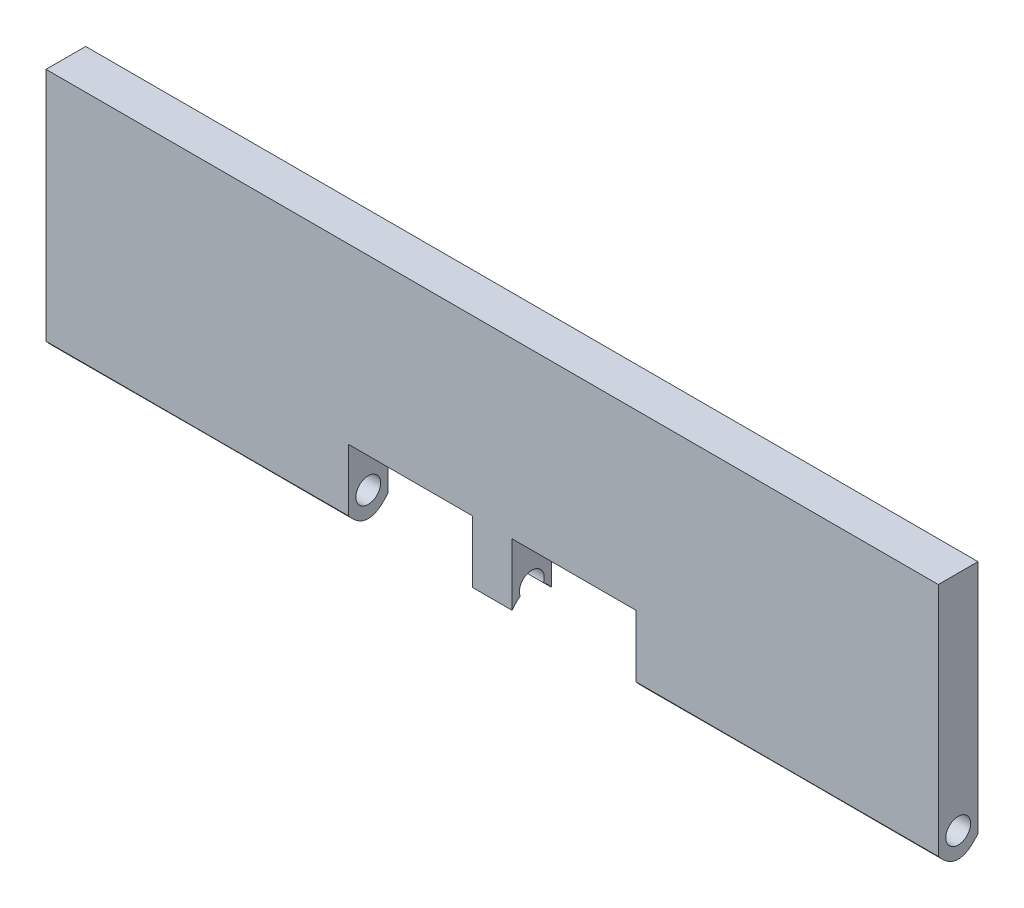
ISO-10303-21;
HEADER;
FILE_DESCRIPTION(('STEP AP214'),'2;1');
FILE_NAME('part.step','',(''),(''),'','','');
FILE_SCHEMA(('AUTOMOTIVE_DESIGN { 1 0 10303 214 1 1 1 1 }'));
ENDSEC;
DATA;
#1=APPLICATION_CONTEXT('core data for automotive mechanical design processes');
#2=APPLICATION_PROTOCOL_DEFINITION('international standard','automotive_design',2000,#1);
#3=PRODUCT_CONTEXT('',#1,'mechanical');
#4=PRODUCT('Part','Part','',(#3));
#5=PRODUCT_RELATED_PRODUCT_CATEGORY('part','',(#4));
#6=PRODUCT_DEFINITION_FORMATION('','',#4);
#7=PRODUCT_DEFINITION_CONTEXT('part definition',#1,'design');
#8=PRODUCT_DEFINITION('design','',#6,#7);
#9=PRODUCT_DEFINITION_SHAPE('','',#8);
#10=(LENGTH_UNIT() NAMED_UNIT(*) SI_UNIT(.MILLI.,.METRE.));
#11=(NAMED_UNIT(*) PLANE_ANGLE_UNIT() SI_UNIT($,.RADIAN.));
#12=(NAMED_UNIT(*) SI_UNIT($,.STERADIAN.) SOLID_ANGLE_UNIT());
#13=UNCERTAINTY_MEASURE_WITH_UNIT(LENGTH_MEASURE(1.E-05),#10,'distance_accuracy_value','');
#14=(GEOMETRIC_REPRESENTATION_CONTEXT(3) GLOBAL_UNCERTAINTY_ASSIGNED_CONTEXT((#13)) GLOBAL_UNIT_ASSIGNED_CONTEXT((#10,
#11,#12)) REPRESENTATION_CONTEXT('',''));
#15=CARTESIAN_POINT('',(0.,0.,0.));
#16=DIRECTION('',(0.,0.,1.));
#17=DIRECTION('',(1.,0.,0.));
#18=AXIS2_PLACEMENT_3D('',#15,#16,#17);
#19=CARTESIAN_POINT('',(0.,0.,0.));
#20=DIRECTION('',(0.,0.,-1.));
#21=DIRECTION('',(-1.,0.,0.));
#22=AXIS2_PLACEMENT_3D('',#19,#20,#21);
#23=PLANE('',#22);
#24=DIRECTION('',(0.,1.,0.));
#25=VECTOR('',#24,1.);
#26=CARTESIAN_POINT('',(90.,-25.,0.));
#27=LINE('',#26,#25);
#28=CARTESIAN_POINT('',(90.,-22.5,0.));
#29=VERTEX_POINT('',#28);
#30=CARTESIAN_POINT('',(90.,25.,0.));
#31=VERTEX_POINT('',#30);
#32=EDGE_CURVE('E228',#29,#31,#27,.T.);
#33=ORIENTED_EDGE('',*,*,#32,.F.);
#34=DIRECTION('',(-1.,0.,0.));
#35=VECTOR('',#34,1.);
#36=CARTESIAN_POINT('',(97.0710678118654,-22.5,0.));
#37=LINE('',#36,#35);
#38=CARTESIAN_POINT('',(29.,-22.5,0.));
#39=VERTEX_POINT('',#38);
#40=EDGE_CURVE('E304',#29,#39,#37,.T.);
#41=ORIENTED_EDGE('',*,*,#40,.T.);
#42=DIRECTION('',(0.,-1.,0.));
#43=VECTOR('',#42,1.);
#44=CARTESIAN_POINT('',(29.,-25.,0.));
#45=LINE('',#44,#43);
#46=CARTESIAN_POINT('',(28.9999999999999,-10.,0.));
#47=VERTEX_POINT('',#46);
#48=EDGE_CURVE('E246',#47,#39,#45,.T.);
#49=ORIENTED_EDGE('',*,*,#48,.F.);
#50=DIRECTION('',(1.,0.,0.));
#51=VECTOR('',#50,1.);
#52=CARTESIAN_POINT('',(28.9999999999999,-10.,0.));
#53=LINE('',#52,#51);
#54=CARTESIAN_POINT('',(3.99999999999994,-10.,0.));
#55=VERTEX_POINT('',#54);
#56=EDGE_CURVE('E244',#55,#47,#53,.T.);
#57=ORIENTED_EDGE('',*,*,#56,.F.);
#58=DIRECTION('',(0.,1.,0.));
#59=VECTOR('',#58,1.);
#60=CARTESIAN_POINT('',(3.99999999999994,-10.,0.));
#61=LINE('',#60,#59);
#62=CARTESIAN_POINT('',(3.99999999999995,-22.5,0.));
#63=VERTEX_POINT('',#62);
#64=EDGE_CURVE('E242',#63,#55,#61,.T.);
#65=ORIENTED_EDGE('',*,*,#64,.F.);
#66=DIRECTION('',(-1.,0.,0.));
#67=VECTOR('',#66,1.);
#68=CARTESIAN_POINT('',(0.,-22.5,0.));
#69=LINE('',#68,#67);
#70=CARTESIAN_POINT('',(-4.,-22.5,0.));
#71=VERTEX_POINT('',#70);
#72=EDGE_CURVE('E268',#63,#71,#69,.T.);
#73=ORIENTED_EDGE('',*,*,#72,.T.);
#74=DIRECTION('',(0.,-1.,0.));
#75=VECTOR('',#74,1.);
#76=CARTESIAN_POINT('',(-4.,-10.,0.));
#77=LINE('',#76,#75);
#78=CARTESIAN_POINT('',(-4.,-10.,0.));
#79=VERTEX_POINT('',#78);
#80=EDGE_CURVE('E240',#79,#71,#77,.T.);
#81=ORIENTED_EDGE('',*,*,#80,.F.);
#82=DIRECTION('',(1.,0.,0.));
#83=VECTOR('',#82,1.);
#84=CARTESIAN_POINT('',(-29.,-10.,0.));
#85=LINE('',#84,#83);
#86=CARTESIAN_POINT('',(-29.,-10.,0.));
#87=VERTEX_POINT('',#86);
#88=EDGE_CURVE('E238',#87,#79,#85,.T.);
#89=ORIENTED_EDGE('',*,*,#88,.F.);
#90=DIRECTION('',(0.,1.,0.));
#91=VECTOR('',#90,1.);
#92=CARTESIAN_POINT('',(-29.,-25.,0.));
#93=LINE('',#92,#91);
#94=CARTESIAN_POINT('',(-29.,-22.5,0.));
#95=VERTEX_POINT('',#94);
#96=EDGE_CURVE('E236',#95,#87,#93,.T.);
#97=ORIENTED_EDGE('',*,*,#96,.F.);
#98=CARTESIAN_POINT('',(-90.,-22.5,0.));
#99=VERTEX_POINT('',#98);
#100=EDGE_CURVE('E195',#95,#99,#69,.T.);
#101=ORIENTED_EDGE('',*,*,#100,.T.);
#102=DIRECTION('',(0.,-1.,0.));
#103=VECTOR('',#102,1.);
#104=CARTESIAN_POINT('',(-90.,-25.,0.));
#105=LINE('',#104,#103);
#106=CARTESIAN_POINT('',(-90.,25.,0.));
#107=VERTEX_POINT('',#106);
#108=EDGE_CURVE('E233',#107,#99,#105,.T.);
#109=ORIENTED_EDGE('',*,*,#108,.F.);
#110=DIRECTION('',(-1.,0.,0.));
#111=VECTOR('',#110,1.);
#112=CARTESIAN_POINT('',(-90.,25.,0.));
#113=LINE('',#112,#111);
#114=EDGE_CURVE('E230',#31,#107,#113,.T.);
#115=ORIENTED_EDGE('',*,*,#114,.F.);
#116=EDGE_LOOP('',(#33,#41,#49,#57,#65,#73,#81,#89,#97,#101,#109,#115));
#117=FACE_BOUND('',#116,.T.);
#118=DIRECTION('',(1.,0.,0.));
#119=VECTOR('',#118,1.);
#120=CARTESIAN_POINT('',(-2.5,4.5,0.));
#121=LINE('',#120,#119);
#122=CARTESIAN_POINT('',(-2.5,4.5,0.));
#123=VERTEX_POINT('',#122);
#124=CARTESIAN_POINT('',(2.5,4.5,0.));
#125=VERTEX_POINT('',#124);
#126=EDGE_CURVE('E406',#123,#125,#121,.T.);
#127=ORIENTED_EDGE('',*,*,#126,.F.);
#128=DIRECTION('',(0.,-1.,0.));
#129=VECTOR('',#128,1.);
#130=CARTESIAN_POINT('',(-2.5,4.5,0.));
#131=LINE('',#130,#129);
#132=CARTESIAN_POINT('',(-2.5,-4.5,0.));
#133=VERTEX_POINT('',#132);
#134=EDGE_CURVE('E395',#123,#133,#131,.T.);
#135=ORIENTED_EDGE('',*,*,#134,.T.);
#136=DIRECTION('',(1.,0.,0.));
#137=VECTOR('',#136,1.);
#138=CARTESIAN_POINT('',(-2.5,-4.5,0.));
#139=LINE('',#138,#137);
#140=CARTESIAN_POINT('',(2.5,-4.5,0.));
#141=VERTEX_POINT('',#140);
#142=EDGE_CURVE('E404',#133,#141,#139,.T.);
#143=ORIENTED_EDGE('',*,*,#142,.T.);
#144=DIRECTION('',(0.,-1.,0.));
#145=VECTOR('',#144,1.);
#146=CARTESIAN_POINT('',(2.5,4.5,0.));
#147=LINE('',#146,#145);
#148=EDGE_CURVE('E380',#125,#141,#147,.T.);
#149=ORIENTED_EDGE('',*,*,#148,.F.);
#150=EDGE_LOOP('',(#127,#135,#143,#149));
#151=FACE_BOUND('',#150,.T.);
#152=ADVANCED_FACE('F66',(#117,#151),#23,.T.);
#153=CARTESIAN_POINT('',(90.,-25.,8.));
#154=DIRECTION('',(-1.,0.,0.));
#155=DIRECTION('',(0.,0.,1.));
#156=AXIS2_PLACEMENT_3D('',#153,#154,#155);
#157=PLANE('',#156);
#158=CARTESIAN_POINT('',(90.,-20.,4.));
#159=DIRECTION('',(-1.,0.,0.));
#160=DIRECTION('',(0.,0.,1.));
#161=AXIS2_PLACEMENT_3D('',#158,#159,#160);
#162=CIRCLE('',#161,2.5);
#163=CARTESIAN_POINT('',(90.,-20.,6.5));
#164=VERTEX_POINT('',#163);
#165=EDGE_CURVE('E272',#164,#164,#162,.F.);
#166=ORIENTED_EDGE('',*,*,#165,.F.);
#167=EDGE_LOOP('',(#166));
#168=FACE_BOUND('',#167,.T.);
#169=CARTESIAN_POINT('',(90.,-22.5,0.));
#170=CARTESIAN_POINT('',(90.,-27.5,4.));
#171=CARTESIAN_POINT('',(90.,-22.5,8.));
#172=B_SPLINE_CURVE_WITH_KNOTS('',2,(#169,#170,#171),.UNSPECIFIED.,.F.,.F.,(3,3),(0.,1.),.UNSPECIFIED.);
#173=CARTESIAN_POINT('',(90.,-22.5,8.));
#174=VERTEX_POINT('',#173);
#175=EDGE_CURVE('E306',#174,#29,#172,.F.);
#176=ORIENTED_EDGE('',*,*,#175,.T.);
#177=ORIENTED_EDGE('',*,*,#32,.T.);
#178=DIRECTION('',(0.,0.,-1.));
#179=VECTOR('',#178,1.);
#180=CARTESIAN_POINT('',(90.,25.,8.));
#181=LINE('',#180,#179);
#182=CARTESIAN_POINT('',(90.,25.,8.));
#183=VERTEX_POINT('',#182);
#184=EDGE_CURVE('E263',#183,#31,#181,.T.);
#185=ORIENTED_EDGE('',*,*,#184,.F.);
#186=DIRECTION('',(0.,1.,0.));
#187=VECTOR('',#186,1.);
#188=CARTESIAN_POINT('',(90.,-25.,8.));
#189=LINE('',#188,#187);
#190=EDGE_CURVE('E249',#174,#183,#189,.T.);
#191=ORIENTED_EDGE('',*,*,#190,.F.);
#192=EDGE_LOOP('',(#176,#177,#185,#191));
#193=FACE_BOUND('',#192,.T.);
#194=ADVANCED_FACE('F68',(#168,#193),#157,.F.);
#195=CARTESIAN_POINT('',(-90.,-25.,8.));
#196=DIRECTION('',(1.,0.,0.));
#197=DIRECTION('',(0.,0.,-1.));
#198=AXIS2_PLACEMENT_3D('',#195,#196,#197);
#199=PLANE('',#198);
#200=CARTESIAN_POINT('',(-90.,-20.,4.));
#201=DIRECTION('',(-1.,0.,0.));
#202=DIRECTION('',(0.,0.,1.));
#203=AXIS2_PLACEMENT_3D('',#200,#201,#202);
#204=CIRCLE('',#203,2.5);
#205=CARTESIAN_POINT('',(-90.,-20.,6.5));
#206=VERTEX_POINT('',#205);
#207=EDGE_CURVE('E403',#206,#206,#204,.T.);
#208=ORIENTED_EDGE('',*,*,#207,.F.);
#209=EDGE_LOOP('',(#208));
#210=FACE_BOUND('',#209,.T.);
#211=ORIENTED_EDGE('',*,*,#108,.T.);
#212=CARTESIAN_POINT('',(-90.,-22.5,0.));
#213=CARTESIAN_POINT('',(-90.,-27.5,4.));
#214=CARTESIAN_POINT('',(-90.,-22.5,8.));
#215=B_SPLINE_CURVE_WITH_KNOTS('',2,(#212,#213,#214),.UNSPECIFIED.,.F.,.F.,(3,3),(0.,1.),.UNSPECIFIED.);
#216=CARTESIAN_POINT('',(-90.,-22.5,8.));
#217=VERTEX_POINT('',#216);
#218=EDGE_CURVE('E299',#99,#217,#215,.T.);
#219=ORIENTED_EDGE('',*,*,#218,.T.);
#220=DIRECTION('',(0.,-1.,0.));
#221=VECTOR('',#220,1.);
#222=CARTESIAN_POINT('',(-90.,-25.,8.));
#223=LINE('',#222,#221);
#224=CARTESIAN_POINT('',(-90.,25.,8.));
#225=VERTEX_POINT('',#224);
#226=EDGE_CURVE('E336',#225,#217,#223,.T.);
#227=ORIENTED_EDGE('',*,*,#226,.F.);
#228=DIRECTION('',(0.,0.,-1.));
#229=VECTOR('',#228,1.);
#230=CARTESIAN_POINT('',(-90.,25.,8.));
#231=LINE('',#230,#229);
#232=EDGE_CURVE('E260',#225,#107,#231,.T.);
#233=ORIENTED_EDGE('',*,*,#232,.T.);
#234=EDGE_LOOP('',(#211,#219,#227,#233));
#235=FACE_BOUND('',#234,.T.);
#236=ADVANCED_FACE('F339',(#210,#235),#199,.F.);
#237=CARTESIAN_POINT('',(-29.,-25.,8.));
#238=DIRECTION('',(-1.,0.,0.));
#239=DIRECTION('',(0.,-1.,0.));
#240=AXIS2_PLACEMENT_3D('',#237,#238,#239);
#241=PLANE('',#240);
#242=CARTESIAN_POINT('',(-29.,-20.,4.));
#243=DIRECTION('',(-1.,0.,0.));
#244=DIRECTION('',(0.,-1.,0.));
#245=AXIS2_PLACEMENT_3D('',#242,#243,#244);
#246=CIRCLE('',#245,2.5);
#247=CARTESIAN_POINT('',(-29.,-22.5,4.));
#248=VERTEX_POINT('',#247);
#249=EDGE_CURVE('E309',#248,#248,#246,.T.);
#250=ORIENTED_EDGE('',*,*,#249,.T.);
#251=EDGE_LOOP('',(#250));
#252=FACE_BOUND('',#251,.T.);
#253=CARTESIAN_POINT('',(-29.,-22.5,0.));
#254=CARTESIAN_POINT('',(-29.,-27.5,4.));
#255=CARTESIAN_POINT('',(-29.,-22.5,8.));
#256=B_SPLINE_CURVE_WITH_KNOTS('',2,(#253,#254,#255),.UNSPECIFIED.,.F.,.F.,(3,3),(0.,1.),.UNSPECIFIED.);
#257=CARTESIAN_POINT('',(-29.,-22.5,8.));
#258=VERTEX_POINT('',#257);
#259=EDGE_CURVE('E231',#95,#258,#256,.T.);
#260=ORIENTED_EDGE('',*,*,#259,.F.);
#261=ORIENTED_EDGE('',*,*,#96,.T.);
#262=DIRECTION('',(0.,0.,-1.));
#263=VECTOR('',#262,1.);
#264=CARTESIAN_POINT('',(-29.,-10.,8.));
#265=LINE('',#264,#263);
#266=CARTESIAN_POINT('',(-29.,-10.,8.));
#267=VERTEX_POINT('',#266);
#268=EDGE_CURVE('E257',#267,#87,#265,.T.);
#269=ORIENTED_EDGE('',*,*,#268,.F.);
#270=DIRECTION('',(0.,1.,0.));
#271=VECTOR('',#270,1.);
#272=CARTESIAN_POINT('',(-29.,-25.,8.));
#273=LINE('',#272,#271);
#274=EDGE_CURVE('E219',#258,#267,#273,.T.);
#275=ORIENTED_EDGE('',*,*,#274,.F.);
#276=EDGE_LOOP('',(#260,#261,#269,#275));
#277=FACE_BOUND('',#276,.T.);
#278=ADVANCED_FACE('F291',(#252,#277),#241,.F.);
#279=CARTESIAN_POINT('',(-4.,-10.,8.));
#280=DIRECTION('',(1.,0.,0.));
#281=DIRECTION('',(0.,1.,0.));
#282=AXIS2_PLACEMENT_3D('',#279,#280,#281);
#283=PLANE('',#282);
#284=ORIENTED_EDGE('',*,*,#80,.T.);
#285=CARTESIAN_POINT('',(-4.,-22.5,8.));
#286=CARTESIAN_POINT('',(-4.,-17.5,4.));
#287=CARTESIAN_POINT('',(-4.,-22.5,0.));
#288=B_SPLINE_CURVE_WITH_KNOTS('',2,(#285,#286,#287),.UNSPECIFIED.,.F.,.F.,(3,3),(0.,1.),.UNSPECIFIED.);
#289=CARTESIAN_POINT('',(-4.,-20.8607881008494,1.65286475774486));
#290=VERTEX_POINT('',#289);
#291=EDGE_CURVE('E208',#290,#71,#288,.T.);
#292=ORIENTED_EDGE('',*,*,#291,.F.);
#293=CARTESIAN_POINT('',(-4.,-20.,4.));
#294=DIRECTION('',(1.,0.,0.));
#295=DIRECTION('',(0.,1.,0.));
#296=AXIS2_PLACEMENT_3D('',#293,#294,#295);
#297=CIRCLE('',#296,2.5);
#298=CARTESIAN_POINT('',(-4.,-20.8607881008494,6.34713524225514));
#299=VERTEX_POINT('',#298);
#300=EDGE_CURVE('E207',#290,#299,#297,.T.);
#301=ORIENTED_EDGE('',*,*,#300,.T.);
#302=CARTESIAN_POINT('',(-4.,-22.5,8.));
#303=VERTEX_POINT('',#302);
#304=EDGE_CURVE('E81',#303,#299,#288,.T.);
#305=ORIENTED_EDGE('',*,*,#304,.F.);
#306=DIRECTION('',(0.,-1.,0.));
#307=VECTOR('',#306,1.);
#308=CARTESIAN_POINT('',(-4.,-10.,8.));
#309=LINE('',#308,#307);
#310=CARTESIAN_POINT('',(-4.,-10.,8.));
#311=VERTEX_POINT('',#310);
#312=EDGE_CURVE('E204',#311,#303,#309,.T.);
#313=ORIENTED_EDGE('',*,*,#312,.F.);
#314=DIRECTION('',(0.,0.,-1.));
#315=VECTOR('',#314,1.);
#316=CARTESIAN_POINT('',(-4.,-10.,8.));
#317=LINE('',#316,#315);
#318=EDGE_CURVE('E255',#311,#79,#317,.T.);
#319=ORIENTED_EDGE('',*,*,#318,.T.);
#320=EDGE_LOOP('',(#284,#292,#301,#305,#313,#319));
#321=FACE_BOUND('',#320,.T.);
#322=ADVANCED_FACE('F202',(#321),#283,.F.);
#323=CARTESIAN_POINT('',(3.99999999999994,-10.,8.));
#324=DIRECTION('',(-1.,0.,0.));
#325=DIRECTION('',(0.,-1.,0.));
#326=AXIS2_PLACEMENT_3D('',#323,#324,#325);
#327=PLANE('',#326);
#328=DIRECTION('',(0.,1.,0.));
#329=VECTOR('',#328,1.);
#330=CARTESIAN_POINT('',(3.99999999999994,-10.,8.));
#331=LINE('',#330,#329);
#332=CARTESIAN_POINT('',(3.99999999999995,-22.5,8.));
#333=VERTEX_POINT('',#332);
#334=CARTESIAN_POINT('',(3.99999999999994,-10.,8.));
#335=VERTEX_POINT('',#334);
#336=EDGE_CURVE('E215',#333,#335,#331,.T.);
#337=ORIENTED_EDGE('',*,*,#336,.F.);
#338=CARTESIAN_POINT('',(3.99999999999995,-22.5,8.));
#339=CARTESIAN_POINT('',(3.99999999999994,-17.5,4.));
#340=CARTESIAN_POINT('',(3.99999999999995,-22.5,0.));
#341=B_SPLINE_CURVE_WITH_KNOTS('',2,(#338,#339,#340),.UNSPECIFIED.,.F.,.F.,(3,3),(0.,1.),.UNSPECIFIED.);
#342=CARTESIAN_POINT('',(3.99999999999995,-20.8607881008494,6.34713524225515));
#343=VERTEX_POINT('',#342);
#344=EDGE_CURVE('E191',#343,#333,#341,.F.);
#345=ORIENTED_EDGE('',*,*,#344,.F.);
#346=CARTESIAN_POINT('',(3.99999999999999,-20.,4.));
#347=DIRECTION('',(-1.,0.,0.));
#348=DIRECTION('',(0.,-1.,0.));
#349=AXIS2_PLACEMENT_3D('',#346,#347,#348);
#350=CIRCLE('',#349,2.5);
#351=CARTESIAN_POINT('',(3.99999999999999,-20.8607881008494,1.65286475774486));
#352=VERTEX_POINT('',#351);
#353=EDGE_CURVE('E271',#343,#352,#350,.T.);
#354=ORIENTED_EDGE('',*,*,#353,.T.);
#355=EDGE_CURVE('E88',#63,#352,#341,.F.);
#356=ORIENTED_EDGE('',*,*,#355,.F.);
#357=ORIENTED_EDGE('',*,*,#64,.T.);
#358=DIRECTION('',(0.,0.,-1.));
#359=VECTOR('',#358,1.);
#360=CARTESIAN_POINT('',(3.99999999999994,-10.,8.));
#361=LINE('',#360,#359);
#362=EDGE_CURVE('E252',#335,#55,#361,.T.);
#363=ORIENTED_EDGE('',*,*,#362,.F.);
#364=EDGE_LOOP('',(#337,#345,#354,#356,#357,#363));
#365=FACE_BOUND('',#364,.T.);
#366=ADVANCED_FACE('F360',(#365),#327,.F.);
#367=CARTESIAN_POINT('',(29.,-25.,8.));
#368=DIRECTION('',(1.,0.,0.));
#369=DIRECTION('',(0.,1.,0.));
#370=AXIS2_PLACEMENT_3D('',#367,#368,#369);
#371=PLANE('',#370);
#372=CARTESIAN_POINT('',(29.,-20.,4.));
#373=DIRECTION('',(1.,0.,0.));
#374=DIRECTION('',(0.,1.,0.));
#375=AXIS2_PLACEMENT_3D('',#372,#373,#374);
#376=CIRCLE('',#375,2.5);
#377=CARTESIAN_POINT('',(29.,-17.5,4.));
#378=VERTEX_POINT('',#377);
#379=EDGE_CURVE('E269',#378,#378,#376,.T.);
#380=ORIENTED_EDGE('',*,*,#379,.T.);
#381=EDGE_LOOP('',(#380));
#382=FACE_BOUND('',#381,.T.);
#383=ORIENTED_EDGE('',*,*,#48,.T.);
#384=CARTESIAN_POINT('',(29.,-22.5,0.));
#385=CARTESIAN_POINT('',(29.,-27.5,4.));
#386=CARTESIAN_POINT('',(29.,-22.5,8.));
#387=B_SPLINE_CURVE_WITH_KNOTS('',2,(#384,#385,#386),.UNSPECIFIED.,.F.,.F.,(3,3),(0.,1.),.UNSPECIFIED.);
#388=CARTESIAN_POINT('',(29.,-22.5,8.));
#389=VERTEX_POINT('',#388);
#390=EDGE_CURVE('E295',#389,#39,#387,.F.);
#391=ORIENTED_EDGE('',*,*,#390,.F.);
#392=DIRECTION('',(0.,-1.,0.));
#393=VECTOR('',#392,1.);
#394=CARTESIAN_POINT('',(29.,-25.,8.));
#395=LINE('',#394,#393);
#396=CARTESIAN_POINT('',(28.9999999999999,-10.,8.));
#397=VERTEX_POINT('',#396);
#398=EDGE_CURVE('E224',#397,#389,#395,.T.);
#399=ORIENTED_EDGE('',*,*,#398,.F.);
#400=DIRECTION('',(0.,0.,-1.));
#401=VECTOR('',#400,1.);
#402=CARTESIAN_POINT('',(28.9999999999999,-10.,8.));
#403=LINE('',#402,#401);
#404=EDGE_CURVE('E227',#397,#47,#403,.T.);
#405=ORIENTED_EDGE('',*,*,#404,.T.);
#406=EDGE_LOOP('',(#383,#391,#399,#405));
#407=FACE_BOUND('',#406,.T.);
#408=ADVANCED_FACE('F352',(#382,#407),#371,.F.);
#409=CARTESIAN_POINT('',(0.,0.,8.));
#410=DIRECTION('',(0.,0.,-1.));
#411=DIRECTION('',(-1.,0.,0.));
#412=AXIS2_PLACEMENT_3D('',#409,#410,#411);
#413=PLANE('',#412);
#414=DIRECTION('',(-1.,0.,0.));
#415=VECTOR('',#414,1.);
#416=CARTESIAN_POINT('',(97.0710678118654,-22.5,8.));
#417=LINE('',#416,#415);
#418=EDGE_CURVE('E303',#174,#389,#417,.T.);
#419=ORIENTED_EDGE('',*,*,#418,.F.);
#420=ORIENTED_EDGE('',*,*,#190,.T.);
#421=DIRECTION('',(-1.,0.,0.));
#422=VECTOR('',#421,1.);
#423=CARTESIAN_POINT('',(-90.,25.,8.));
#424=LINE('',#423,#422);
#425=EDGE_CURVE('E334',#183,#225,#424,.T.);
#426=ORIENTED_EDGE('',*,*,#425,.T.);
#427=ORIENTED_EDGE('',*,*,#226,.T.);
#428=DIRECTION('',(-1.,0.,0.));
#429=VECTOR('',#428,1.);
#430=CARTESIAN_POINT('',(0.,-22.5,8.));
#431=LINE('',#430,#429);
#432=EDGE_CURVE('E196',#258,#217,#431,.T.);
#433=ORIENTED_EDGE('',*,*,#432,.F.);
#434=ORIENTED_EDGE('',*,*,#274,.T.);
#435=DIRECTION('',(1.,0.,0.));
#436=VECTOR('',#435,1.);
#437=CARTESIAN_POINT('',(-29.,-10.,8.));
#438=LINE('',#437,#436);
#439=EDGE_CURVE('E213',#267,#311,#438,.T.);
#440=ORIENTED_EDGE('',*,*,#439,.T.);
#441=ORIENTED_EDGE('',*,*,#312,.T.);
#442=EDGE_CURVE('E188',#333,#303,#431,.T.);
#443=ORIENTED_EDGE('',*,*,#442,.F.);
#444=ORIENTED_EDGE('',*,*,#336,.T.);
#445=DIRECTION('',(1.,0.,0.));
#446=VECTOR('',#445,1.);
#447=CARTESIAN_POINT('',(28.9999999999999,-10.,8.));
#448=LINE('',#447,#446);
#449=EDGE_CURVE('E217',#335,#397,#448,.T.);
#450=ORIENTED_EDGE('',*,*,#449,.T.);
#451=ORIENTED_EDGE('',*,*,#398,.T.);
#452=EDGE_LOOP('',(#419,#420,#426,#427,#433,#434,#440,#441,#443,#444,#450,#451));
#453=FACE_BOUND('',#452,.T.);
#454=ADVANCED_FACE('F211',(#453),#413,.F.);
#455=CARTESIAN_POINT('',(-90.,25.,8.));
#456=DIRECTION('',(0.,-1.,0.));
#457=DIRECTION('',(0.,0.,-1.));
#458=AXIS2_PLACEMENT_3D('',#455,#456,#457);
#459=PLANE('',#458);
#460=ORIENTED_EDGE('',*,*,#114,.T.);
#461=ORIENTED_EDGE('',*,*,#232,.F.);
#462=ORIENTED_EDGE('',*,*,#425,.F.);
#463=ORIENTED_EDGE('',*,*,#184,.T.);
#464=EDGE_LOOP('',(#460,#461,#462,#463));
#465=FACE_BOUND('',#464,.T.);
#466=ADVANCED_FACE('F343',(#465),#459,.F.);
#467=CARTESIAN_POINT('',(-29.,-10.,8.));
#468=DIRECTION('',(0.,1.,0.));
#469=DIRECTION('',(0.,0.,1.));
#470=AXIS2_PLACEMENT_3D('',#467,#468,#469);
#471=PLANE('',#470);
#472=ORIENTED_EDGE('',*,*,#88,.T.);
#473=ORIENTED_EDGE('',*,*,#318,.F.);
#474=ORIENTED_EDGE('',*,*,#439,.F.);
#475=ORIENTED_EDGE('',*,*,#268,.T.);
#476=EDGE_LOOP('',(#472,#473,#474,#475));
#477=FACE_BOUND('',#476,.T.);
#478=ADVANCED_FACE('F285',(#477),#471,.F.);
#479=CARTESIAN_POINT('',(28.9999999999999,-10.,8.));
#480=DIRECTION('',(0.,1.,0.));
#481=DIRECTION('',(-1.,0.,0.));
#482=AXIS2_PLACEMENT_3D('',#479,#480,#481);
#483=PLANE('',#482);
#484=ORIENTED_EDGE('',*,*,#56,.T.);
#485=ORIENTED_EDGE('',*,*,#404,.F.);
#486=ORIENTED_EDGE('',*,*,#449,.F.);
#487=ORIENTED_EDGE('',*,*,#362,.T.);
#488=EDGE_LOOP('',(#484,#485,#486,#487));
#489=FACE_BOUND('',#488,.T.);
#490=ADVANCED_FACE('F357',(#489),#483,.F.);
#491=CARTESIAN_POINT('',(97.0710678118654,-22.5,0.));
#492=CARTESIAN_POINT('',(97.0710678118654,-27.5,4.));
#493=CARTESIAN_POINT('',(97.0710678118654,-22.5,8.));
#494=B_SPLINE_CURVE_WITH_KNOTS('',2,(#491,#492,#493),.UNSPECIFIED.,.F.,.F.,(3,3),(0.,1.),.UNSPECIFIED.);
#495=DIRECTION('',(-1.,0.,0.));
#496=VECTOR('',#495,1.);
#497=SURFACE_OF_LINEAR_EXTRUSION('',#494,#496);
#498=ORIENTED_EDGE('',*,*,#259,.T.);
#499=ORIENTED_EDGE('',*,*,#432,.T.);
#500=ORIENTED_EDGE('',*,*,#218,.F.);
#501=ORIENTED_EDGE('',*,*,#100,.F.);
#502=EDGE_LOOP('',(#498,#499,#500,#501));
#503=FACE_BOUND('',#502,.T.);
#504=ADVANCED_FACE('F297',(#503),#497,.T.);
#505=ORIENTED_EDGE('',*,*,#390,.T.);
#506=ORIENTED_EDGE('',*,*,#40,.F.);
#507=ORIENTED_EDGE('',*,*,#175,.F.);
#508=ORIENTED_EDGE('',*,*,#418,.T.);
#509=EDGE_LOOP('',(#505,#506,#507,#508));
#510=FACE_BOUND('',#509,.T.);
#511=ADVANCED_FACE('F348',(#510),#497,.T.);
#512=CARTESIAN_POINT('',(97.0710678118654,-20.,4.));
#513=DIRECTION('',(-1.,0.,0.));
#514=DIRECTION('',(0.,0.,1.));
#515=AXIS2_PLACEMENT_3D('',#512,#513,#514);
#516=CYLINDRICAL_SURFACE('',#515,2.5);
#517=ORIENTED_EDGE('',*,*,#165,.T.);
#518=EDGE_LOOP('',(#517));
#519=FACE_BOUND('',#518,.T.);
#520=ORIENTED_EDGE('',*,*,#379,.F.);
#521=EDGE_LOOP('',(#520));
#522=FACE_BOUND('',#521,.T.);
#523=ADVANCED_FACE('F431',(#519,#522),#516,.F.);
#524=ORIENTED_EDGE('',*,*,#353,.F.);
#525=DIRECTION('',(-1.,0.,0.));
#526=VECTOR('',#525,1.);
#527=CARTESIAN_POINT('',(0.,-20.8607881008494,6.34713524225515));
#528=LINE('',#527,#526);
#529=EDGE_CURVE('E12',#343,#299,#528,.T.);
#530=ORIENTED_EDGE('',*,*,#529,.T.);
#531=ORIENTED_EDGE('',*,*,#300,.F.);
#532=DIRECTION('',(-1.,0.,0.));
#533=VECTOR('',#532,1.);
#534=CARTESIAN_POINT('',(0.,-20.8607881008494,1.65286475774486));
#535=LINE('',#534,#533);
#536=EDGE_CURVE('E74',#290,#352,#535,.F.);
#537=ORIENTED_EDGE('',*,*,#536,.T.);
#538=EDGE_LOOP('',(#524,#530,#531,#537));
#539=FACE_BOUND('',#538,.T.);
#540=ADVANCED_FACE('F428',(#539),#516,.F.);
#541=ORIENTED_EDGE('',*,*,#207,.T.);
#542=EDGE_LOOP('',(#541));
#543=FACE_BOUND('',#542,.T.);
#544=ORIENTED_EDGE('',*,*,#249,.F.);
#545=EDGE_LOOP('',(#544));
#546=FACE_BOUND('',#545,.T.);
#547=ADVANCED_FACE('F425',(#543,#546),#516,.F.);
#548=CARTESIAN_POINT('',(-2.5,0.,-5.));
#549=DIRECTION('',(1.,0.,0.));
#550=DIRECTION('',(0.,0.,-1.));
#551=AXIS2_PLACEMENT_3D('',#548,#549,#550);
#552=CYLINDRICAL_SURFACE('',#551,4.5);
#553=DIRECTION('',(1.,0.,0.));
#554=VECTOR('',#553,1.);
#555=CARTESIAN_POINT('',(-2.5,4.5,-5.));
#556=LINE('',#555,#554);
#557=CARTESIAN_POINT('',(-2.5,4.5,-5.));
#558=VERTEX_POINT('',#557);
#559=CARTESIAN_POINT('',(2.5,4.5,-5.));
#560=VERTEX_POINT('',#559);
#561=EDGE_CURVE('E400',#558,#560,#556,.T.);
#562=ORIENTED_EDGE('',*,*,#561,.T.);
#563=CARTESIAN_POINT('',(2.5,0.,-5.));
#564=DIRECTION('',(1.,0.,0.));
#565=DIRECTION('',(0.,0.,-1.));
#566=AXIS2_PLACEMENT_3D('',#563,#564,#565);
#567=CIRCLE('',#566,4.5);
#568=CARTESIAN_POINT('',(2.5,-4.5,-5.));
#569=VERTEX_POINT('',#568);
#570=EDGE_CURVE('E364',#569,#560,#567,.T.);
#571=ORIENTED_EDGE('',*,*,#570,.F.);
#572=DIRECTION('',(1.,0.,0.));
#573=VECTOR('',#572,1.);
#574=CARTESIAN_POINT('',(-2.5,-4.5,-5.));
#575=LINE('',#574,#573);
#576=CARTESIAN_POINT('',(-2.5,-4.5,-5.));
#577=VERTEX_POINT('',#576);
#578=EDGE_CURVE('E401',#577,#569,#575,.T.);
#579=ORIENTED_EDGE('',*,*,#578,.F.);
#580=CARTESIAN_POINT('',(-2.5,0.,-5.));
#581=DIRECTION('',(1.,0.,0.));
#582=DIRECTION('',(0.,0.,-1.));
#583=AXIS2_PLACEMENT_3D('',#580,#581,#582);
#584=CIRCLE('',#583,4.5);
#585=EDGE_CURVE('E389',#577,#558,#584,.T.);
#586=ORIENTED_EDGE('',*,*,#585,.T.);
#587=EDGE_LOOP('',(#562,#571,#579,#586));
#588=FACE_BOUND('',#587,.T.);
#589=ADVANCED_FACE('F427',(#588),#552,.T.);
#590=CARTESIAN_POINT('',(-2.5,-4.5,-5.));
#591=DIRECTION('',(0.,-1.,0.));
#592=DIRECTION('',(0.,0.,-1.));
#593=AXIS2_PLACEMENT_3D('',#590,#591,#592);
#594=PLANE('',#593);
#595=ORIENTED_EDGE('',*,*,#578,.T.);
#596=DIRECTION('',(0.,0.,-1.));
#597=VECTOR('',#596,1.);
#598=CARTESIAN_POINT('',(2.5,-4.5,-5.));
#599=LINE('',#598,#597);
#600=EDGE_CURVE('E383',#141,#569,#599,.T.);
#601=ORIENTED_EDGE('',*,*,#600,.F.);
#602=ORIENTED_EDGE('',*,*,#142,.F.);
#603=DIRECTION('',(0.,0.,-1.));
#604=VECTOR('',#603,1.);
#605=CARTESIAN_POINT('',(-2.5,-4.5,-5.));
#606=LINE('',#605,#604);
#607=EDGE_CURVE('E397',#133,#577,#606,.T.);
#608=ORIENTED_EDGE('',*,*,#607,.T.);
#609=EDGE_LOOP('',(#595,#601,#602,#608));
#610=FACE_BOUND('',#609,.T.);
#611=ADVANCED_FACE('F437',(#610),#594,.T.);
#612=CARTESIAN_POINT('',(-2.5,4.5,-5.));
#613=DIRECTION('',(0.,1.,0.));
#614=DIRECTION('',(0.,0.,1.));
#615=AXIS2_PLACEMENT_3D('',#612,#613,#614);
#616=PLANE('',#615);
#617=ORIENTED_EDGE('',*,*,#126,.T.);
#618=DIRECTION('',(0.,0.,1.));
#619=VECTOR('',#618,1.);
#620=CARTESIAN_POINT('',(2.5,4.5,-5.));
#621=LINE('',#620,#619);
#622=EDGE_CURVE('E377',#560,#125,#621,.T.);
#623=ORIENTED_EDGE('',*,*,#622,.F.);
#624=ORIENTED_EDGE('',*,*,#561,.F.);
#625=DIRECTION('',(0.,0.,1.));
#626=VECTOR('',#625,1.);
#627=CARTESIAN_POINT('',(-2.5,4.5,-5.));
#628=LINE('',#627,#626);
#629=EDGE_CURVE('E392',#558,#123,#628,.T.);
#630=ORIENTED_EDGE('',*,*,#629,.T.);
#631=EDGE_LOOP('',(#617,#623,#624,#630));
#632=FACE_BOUND('',#631,.T.);
#633=ADVANCED_FACE('F516',(#632),#616,.T.);
#634=CARTESIAN_POINT('',(-2.5,0.,-5.));
#635=DIRECTION('',(1.,0.,0.));
#636=DIRECTION('',(0.,0.,-1.));
#637=AXIS2_PLACEMENT_3D('',#634,#635,#636);
#638=PLANE('',#637);
#639=CARTESIAN_POINT('',(-2.5,0.,-5.));
#640=DIRECTION('',(1.,0.,0.));
#641=DIRECTION('',(0.,0.,-1.));
#642=AXIS2_PLACEMENT_3D('',#639,#640,#641);
#643=CIRCLE('',#642,2.5);
#644=CARTESIAN_POINT('',(-2.5,0.,-7.5));
#645=VERTEX_POINT('',#644);
#646=EDGE_CURVE('E386',#645,#645,#643,.T.);
#647=ORIENTED_EDGE('',*,*,#646,.T.);
#648=EDGE_LOOP('',(#647));
#649=FACE_BOUND('',#648,.T.);
#650=ORIENTED_EDGE('',*,*,#585,.F.);
#651=ORIENTED_EDGE('',*,*,#607,.F.);
#652=ORIENTED_EDGE('',*,*,#134,.F.);
#653=ORIENTED_EDGE('',*,*,#629,.F.);
#654=EDGE_LOOP('',(#650,#651,#652,#653));
#655=FACE_BOUND('',#654,.T.);
#656=ADVANCED_FACE('F512',(#649,#655),#638,.F.);
#657=CARTESIAN_POINT('',(-2.5,0.,-5.));
#658=DIRECTION('',(1.,0.,0.));
#659=DIRECTION('',(0.,0.,-1.));
#660=AXIS2_PLACEMENT_3D('',#657,#658,#659);
#661=CYLINDRICAL_SURFACE('',#660,2.5);
#662=ORIENTED_EDGE('',*,*,#646,.F.);
#663=EDGE_LOOP('',(#662));
#664=FACE_BOUND('',#663,.T.);
#665=CARTESIAN_POINT('',(2.5,0.,-5.));
#666=DIRECTION('',(1.,0.,0.));
#667=DIRECTION('',(0.,0.,-1.));
#668=AXIS2_PLACEMENT_3D('',#665,#666,#667);
#669=CIRCLE('',#668,2.5);
#670=CARTESIAN_POINT('',(2.5,0.,-7.5));
#671=VERTEX_POINT('',#670);
#672=EDGE_CURVE('E361',#671,#671,#669,.T.);
#673=ORIENTED_EDGE('',*,*,#672,.T.);
#674=EDGE_LOOP('',(#673));
#675=FACE_BOUND('',#674,.T.);
#676=ADVANCED_FACE('F508',(#664,#675),#661,.F.);
#677=CARTESIAN_POINT('',(2.5,0.,-5.));
#678=DIRECTION('',(1.,0.,0.));
#679=DIRECTION('',(0.,0.,-1.));
#680=AXIS2_PLACEMENT_3D('',#677,#678,#679);
#681=PLANE('',#680);
#682=ORIENTED_EDGE('',*,*,#570,.T.);
#683=ORIENTED_EDGE('',*,*,#622,.T.);
#684=ORIENTED_EDGE('',*,*,#148,.T.);
#685=ORIENTED_EDGE('',*,*,#600,.T.);
#686=EDGE_LOOP('',(#682,#683,#684,#685));
#687=FACE_BOUND('',#686,.T.);
#688=ORIENTED_EDGE('',*,*,#672,.F.);
#689=EDGE_LOOP('',(#688));
#690=FACE_BOUND('',#689,.T.);
#691=ADVANCED_FACE('F487',(#687,#690),#681,.T.);
#692=CARTESIAN_POINT('',(13.4339811320295,-22.5,8.));
#693=CARTESIAN_POINT('',(13.4339811320295,-17.5,4.));
#694=CARTESIAN_POINT('',(13.4339811320295,-22.5,0.));
#695=B_SPLINE_CURVE_WITH_KNOTS('',2,(#692,#693,#694),.UNSPECIFIED.,.F.,.F.,(3,3),(0.,1.),.UNSPECIFIED.);
#696=DIRECTION('',(-1.,0.,0.));
#697=VECTOR('',#696,1.);
#698=SURFACE_OF_LINEAR_EXTRUSION('',#695,#697);
#699=ORIENTED_EDGE('',*,*,#291,.T.);
#700=ORIENTED_EDGE('',*,*,#72,.F.);
#701=ORIENTED_EDGE('',*,*,#355,.T.);
#702=ORIENTED_EDGE('',*,*,#536,.F.);
#703=EDGE_LOOP('',(#699,#700,#701,#702));
#704=FACE_BOUND('',#703,.T.);
#705=ADVANCED_FACE('F482',(#704),#698,.F.);
#706=ORIENTED_EDGE('',*,*,#344,.T.);
#707=ORIENTED_EDGE('',*,*,#442,.T.);
#708=ORIENTED_EDGE('',*,*,#304,.T.);
#709=ORIENTED_EDGE('',*,*,#529,.F.);
#710=EDGE_LOOP('',(#706,#707,#708,#709));
#711=FACE_BOUND('',#710,.T.);
#712=ADVANCED_FACE('F189',(#711),#698,.F.);
#713=CLOSED_SHELL('',(#152,#194,#236,#278,#322,#366,#408,#454,#466,#478,#490,#504,#511,#523,
#540,#547,#589,#611,#633,#656,#676,#691,#705,#712));
#714=MANIFOLD_SOLID_BREP('B2',#713);
#715=ADVANCED_BREP_SHAPE_REPRESENTATION('',(#18,#714),#14);
#716=SHAPE_DEFINITION_REPRESENTATION(#9,#715);
ENDSEC;
END-ISO-10303-21;
